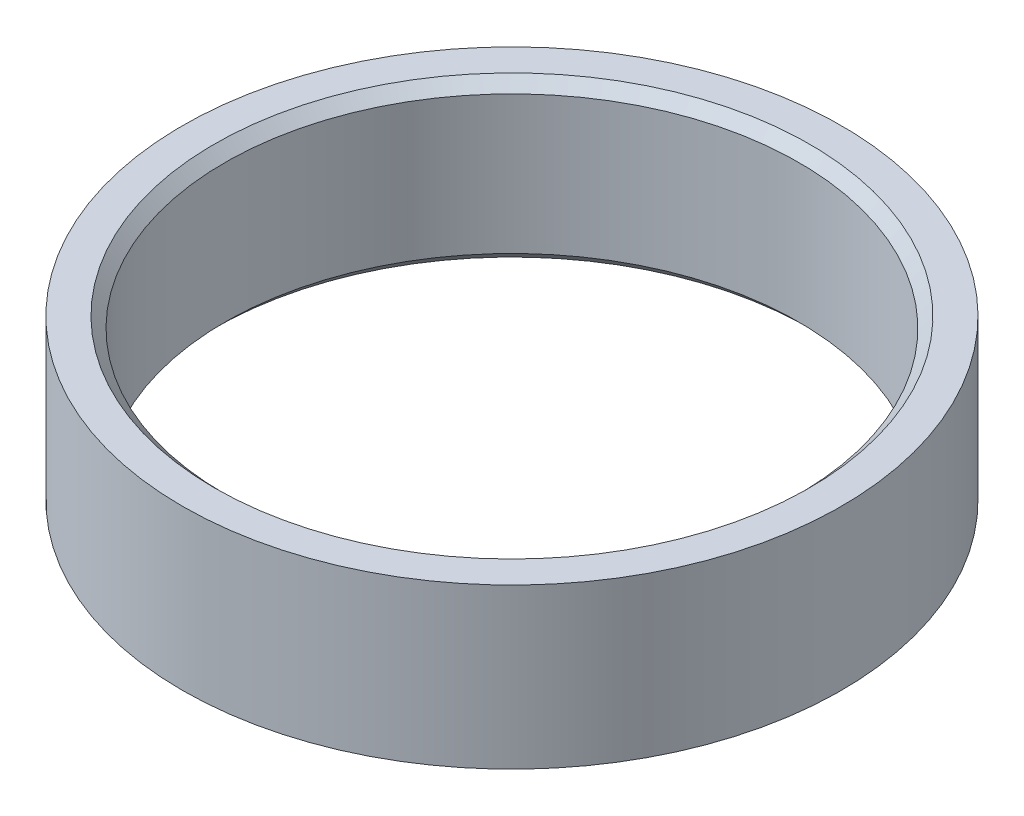
ISO-10303-21;
HEADER;
FILE_DESCRIPTION(('STEP AP214'),'2;1');
FILE_NAME('part.step','',(''),(''),'','','');
FILE_SCHEMA(('AUTOMOTIVE_DESIGN { 1 0 10303 214 1 1 1 1 }'));
ENDSEC;
DATA;
#1=APPLICATION_CONTEXT('core data for automotive mechanical design processes');
#2=APPLICATION_PROTOCOL_DEFINITION('international standard','automotive_design',2000,#1);
#3=PRODUCT_CONTEXT('',#1,'mechanical');
#4=PRODUCT('Part','Part','',(#3));
#5=PRODUCT_RELATED_PRODUCT_CATEGORY('part','',(#4));
#6=PRODUCT_DEFINITION_FORMATION('','',#4);
#7=PRODUCT_DEFINITION_CONTEXT('part definition',#1,'design');
#8=PRODUCT_DEFINITION('design','',#6,#7);
#9=PRODUCT_DEFINITION_SHAPE('','',#8);
#10=(LENGTH_UNIT() NAMED_UNIT(*) SI_UNIT(.MILLI.,.METRE.));
#11=(NAMED_UNIT(*) PLANE_ANGLE_UNIT() SI_UNIT($,.RADIAN.));
#12=(NAMED_UNIT(*) SI_UNIT($,.STERADIAN.) SOLID_ANGLE_UNIT());
#13=UNCERTAINTY_MEASURE_WITH_UNIT(LENGTH_MEASURE(1.E-05),#10,'distance_accuracy_value','');
#14=(GEOMETRIC_REPRESENTATION_CONTEXT(3) GLOBAL_UNCERTAINTY_ASSIGNED_CONTEXT((#13)) GLOBAL_UNIT_ASSIGNED_CONTEXT((#10,
#11,#12)) REPRESENTATION_CONTEXT('',''));
#15=CARTESIAN_POINT('',(0.,0.,0.));
#16=DIRECTION('',(0.,0.,1.));
#17=DIRECTION('',(1.,0.,0.));
#18=AXIS2_PLACEMENT_3D('',#15,#16,#17);
#19=CARTESIAN_POINT('',(0.,7.5,0.));
#20=DIRECTION('',(0.,1.,0.));
#21=DIRECTION('',(0.,0.,1.));
#22=AXIS2_PLACEMENT_3D('',#19,#20,#21);
#23=PLANE('',#22);
#24=CARTESIAN_POINT('',(0.,7.5,0.));
#25=DIRECTION('',(0.,1.,0.));
#26=DIRECTION('',(0.,0.,1.));
#27=AXIS2_PLACEMENT_3D('',#24,#25,#26);
#28=CIRCLE('',#27,14.);
#29=CARTESIAN_POINT('',(0.,7.5,14.));
#30=VERTEX_POINT('',#29);
#31=EDGE_CURVE('E10',#30,#30,#28,.F.);
#32=ORIENTED_EDGE('',*,*,#31,.T.);
#33=EDGE_LOOP('',(#32));
#34=FACE_BOUND('',#33,.T.);
#35=CARTESIAN_POINT('',(0.,7.5,0.));
#36=DIRECTION('',(0.,1.,0.));
#37=DIRECTION('',(0.,0.,1.));
#38=AXIS2_PLACEMENT_3D('',#35,#36,#37);
#39=CIRCLE('',#38,15.5);
#40=CARTESIAN_POINT('',(0.,7.5,15.5));
#41=VERTEX_POINT('',#40);
#42=EDGE_CURVE('E65',#41,#41,#39,.T.);
#43=ORIENTED_EDGE('',*,*,#42,.T.);
#44=EDGE_LOOP('',(#43));
#45=FACE_BOUND('',#44,.T.);
#46=ADVANCED_FACE('F41',(#34,#45),#23,.T.);
#47=CARTESIAN_POINT('',(0.,0.,0.));
#48=DIRECTION('',(0.,1.,0.));
#49=DIRECTION('',(0.,0.,1.));
#50=AXIS2_PLACEMENT_3D('',#47,#48,#49);
#51=PLANE('',#50);
#52=CARTESIAN_POINT('',(0.,0.,0.));
#53=DIRECTION('',(0.,1.,0.));
#54=DIRECTION('',(0.,0.,1.));
#55=AXIS2_PLACEMENT_3D('',#52,#53,#54);
#56=CIRCLE('',#55,14.);
#57=CARTESIAN_POINT('',(0.,0.,14.));
#58=VERTEX_POINT('',#57);
#59=EDGE_CURVE('E60',#58,#58,#56,.T.);
#60=ORIENTED_EDGE('',*,*,#59,.T.);
#61=EDGE_LOOP('',(#60));
#62=FACE_BOUND('',#61,.T.);
#63=CARTESIAN_POINT('',(0.,0.,0.));
#64=DIRECTION('',(0.,1.,0.));
#65=DIRECTION('',(0.,0.,1.));
#66=AXIS2_PLACEMENT_3D('',#63,#64,#65);
#67=CIRCLE('',#66,15.5);
#68=CARTESIAN_POINT('',(0.,0.,15.5));
#69=VERTEX_POINT('',#68);
#70=EDGE_CURVE('E61',#69,#69,#67,.T.);
#71=ORIENTED_EDGE('',*,*,#70,.F.);
#72=EDGE_LOOP('',(#71));
#73=FACE_BOUND('',#72,.T.);
#74=ADVANCED_FACE('F74',(#62,#73),#51,.F.);
#75=CARTESIAN_POINT('',(0.,7.5,0.));
#76=DIRECTION('',(0.,-1.,0.));
#77=DIRECTION('',(0.,0.,-1.));
#78=AXIS2_PLACEMENT_3D('',#75,#76,#77);
#79=CYLINDRICAL_SURFACE('',#78,15.5);
#80=ORIENTED_EDGE('',*,*,#42,.F.);
#81=EDGE_LOOP('',(#80));
#82=FACE_BOUND('',#81,.T.);
#83=ORIENTED_EDGE('',*,*,#70,.T.);
#84=EDGE_LOOP('',(#83));
#85=FACE_BOUND('',#84,.T.);
#86=ADVANCED_FACE('F68',(#82,#85),#79,.T.);
#87=CARTESIAN_POINT('',(0.,7.5,0.));
#88=DIRECTION('',(0.,-1.,0.));
#89=DIRECTION('',(0.,0.,-1.));
#90=AXIS2_PLACEMENT_3D('',#87,#88,#89);
#91=CYLINDRICAL_SURFACE('',#90,13.5);
#92=CARTESIAN_POINT('',(0.,0.499999999999999,0.));
#93=DIRECTION('',(0.,1.,0.));
#94=DIRECTION('',(0.,0.,1.));
#95=AXIS2_PLACEMENT_3D('',#92,#93,#94);
#96=CIRCLE('',#95,13.5);
#97=CARTESIAN_POINT('',(0.,0.499999999999999,13.5));
#98=VERTEX_POINT('',#97);
#99=EDGE_CURVE('E47',#98,#98,#96,.F.);
#100=ORIENTED_EDGE('',*,*,#99,.T.);
#101=EDGE_LOOP('',(#100));
#102=FACE_BOUND('',#101,.T.);
#103=CARTESIAN_POINT('',(0.,7.00000000000001,0.));
#104=DIRECTION('',(0.,1.,0.));
#105=DIRECTION('',(0.,0.,1.));
#106=AXIS2_PLACEMENT_3D('',#103,#104,#105);
#107=CIRCLE('',#106,13.5);
#108=CARTESIAN_POINT('',(0.,7.00000000000001,13.5));
#109=VERTEX_POINT('',#108);
#110=EDGE_CURVE('E52',#109,#109,#107,.T.);
#111=ORIENTED_EDGE('',*,*,#110,.T.);
#112=EDGE_LOOP('',(#111));
#113=FACE_BOUND('',#112,.T.);
#114=ADVANCED_FACE('F71',(#102,#113),#91,.F.);
#115=CARTESIAN_POINT('',(0.,0.,0.));
#116=DIRECTION('',(0.,-1.,0.));
#117=DIRECTION('',(0.,0.,-1.));
#118=AXIS2_PLACEMENT_3D('',#115,#116,#117);
#119=CONICAL_SURFACE('',#118,14.,0.785398163397447);
#120=ORIENTED_EDGE('',*,*,#99,.F.);
#121=EDGE_LOOP('',(#120));
#122=FACE_BOUND('',#121,.T.);
#123=ORIENTED_EDGE('',*,*,#59,.F.);
#124=EDGE_LOOP('',(#123));
#125=FACE_BOUND('',#124,.T.);
#126=ADVANCED_FACE('F88',(#122,#125),#119,.F.);
#127=CARTESIAN_POINT('',(0.,7.00000000000001,0.));
#128=DIRECTION('',(0.,1.,0.));
#129=DIRECTION('',(0.,0.,1.));
#130=AXIS2_PLACEMENT_3D('',#127,#128,#129);
#131=CONICAL_SURFACE('',#130,13.5,0.785398163397457);
#132=ORIENTED_EDGE('',*,*,#31,.F.);
#133=EDGE_LOOP('',(#132));
#134=FACE_BOUND('',#133,.T.);
#135=ORIENTED_EDGE('',*,*,#110,.F.);
#136=EDGE_LOOP('',(#135));
#137=FACE_BOUND('',#136,.T.);
#138=ADVANCED_FACE('F42',(#134,#137),#131,.F.);
#139=CLOSED_SHELL('',(#46,#74,#86,#114,#126,#138));
#140=MANIFOLD_SOLID_BREP('B2',#139);
#141=ADVANCED_BREP_SHAPE_REPRESENTATION('',(#18,#140),#14);
#142=SHAPE_DEFINITION_REPRESENTATION(#9,#141);
ENDSEC;
END-ISO-10303-21;
